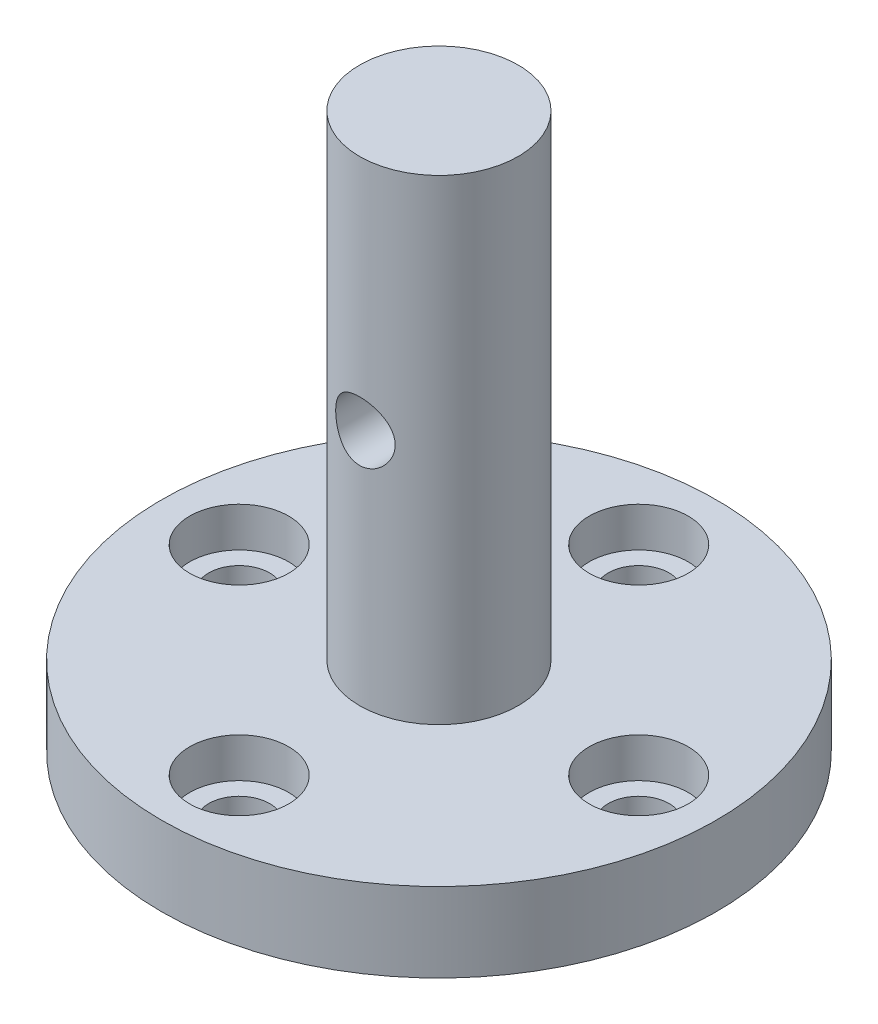
ISO-10303-21;
HEADER;
FILE_DESCRIPTION(('STEP AP214'),'2;1');
FILE_NAME('part.step','',(''),(''),'','','');
FILE_SCHEMA(('AUTOMOTIVE_DESIGN { 1 0 10303 214 1 1 1 1 }'));
ENDSEC;
DATA;
#1=APPLICATION_CONTEXT('core data for automotive mechanical design processes');
#2=APPLICATION_PROTOCOL_DEFINITION('international standard','automotive_design',2000,#1);
#3=PRODUCT_CONTEXT('',#1,'mechanical');
#4=PRODUCT('Part','Part','',(#3));
#5=PRODUCT_RELATED_PRODUCT_CATEGORY('part','',(#4));
#6=PRODUCT_DEFINITION_FORMATION('','',#4);
#7=PRODUCT_DEFINITION_CONTEXT('part definition',#1,'design');
#8=PRODUCT_DEFINITION('design','',#6,#7);
#9=PRODUCT_DEFINITION_SHAPE('','',#8);
#10=(LENGTH_UNIT() NAMED_UNIT(*) SI_UNIT(.MILLI.,.METRE.));
#11=(NAMED_UNIT(*) PLANE_ANGLE_UNIT() SI_UNIT($,.RADIAN.));
#12=(NAMED_UNIT(*) SI_UNIT($,.STERADIAN.) SOLID_ANGLE_UNIT());
#13=UNCERTAINTY_MEASURE_WITH_UNIT(LENGTH_MEASURE(1.E-05),#10,'distance_accuracy_value','');
#14=(GEOMETRIC_REPRESENTATION_CONTEXT(3) GLOBAL_UNCERTAINTY_ASSIGNED_CONTEXT((#13)) GLOBAL_UNIT_ASSIGNED_CONTEXT((#10,
#11,#12)) REPRESENTATION_CONTEXT('',''));
#15=CARTESIAN_POINT('',(0.,0.,0.));
#16=DIRECTION('',(0.,0.,1.));
#17=DIRECTION('',(1.,0.,0.));
#18=AXIS2_PLACEMENT_3D('',#15,#16,#17);
#19=CARTESIAN_POINT('',(8.,3.175,0.));
#20=DIRECTION('',(0.,1.,0.));
#21=DIRECTION('',(0.,0.,1.));
#22=AXIS2_PLACEMENT_3D('',#19,#20,#21);
#23=CYLINDRICAL_SURFACE('',#22,1.21919999999999);
#24=CARTESIAN_POINT('',(8.,0.,0.));
#25=DIRECTION('',(0.,1.,0.));
#26=DIRECTION('',(0.,0.,1.));
#27=AXIS2_PLACEMENT_3D('',#24,#25,#26);
#28=CIRCLE('',#27,1.2192);
#29=CARTESIAN_POINT('',(8.,0.,1.2192));
#30=VERTEX_POINT('',#29);
#31=EDGE_CURVE('E146',#30,#30,#28,.T.);
#32=ORIENTED_EDGE('',*,*,#31,.F.);
#33=EDGE_LOOP('',(#32));
#34=FACE_BOUND('',#33,.T.);
#35=CARTESIAN_POINT('',(8.,1.5875,0.));
#36=DIRECTION('',(0.,1.,0.));
#37=DIRECTION('',(0.,0.,1.));
#38=AXIS2_PLACEMENT_3D('',#35,#36,#37);
#39=CIRCLE('',#38,1.21919999999999);
#40=CARTESIAN_POINT('',(8.,1.5875,1.21919999999999));
#41=VERTEX_POINT('',#40);
#42=EDGE_CURVE('E74',#41,#41,#39,.F.);
#43=ORIENTED_EDGE('',*,*,#42,.F.);
#44=EDGE_LOOP('',(#43));
#45=FACE_BOUND('',#44,.T.);
#46=ADVANCED_FACE('F49',(#34,#45),#23,.F.);
#47=CARTESIAN_POINT('',(-8.,3.175,0.));
#48=DIRECTION('',(0.,1.,0.));
#49=DIRECTION('',(0.,0.,1.));
#50=AXIS2_PLACEMENT_3D('',#47,#48,#49);
#51=CYLINDRICAL_SURFACE('',#50,1.21919999999999);
#52=CARTESIAN_POINT('',(-8.,0.,0.));
#53=DIRECTION('',(0.,1.,0.));
#54=DIRECTION('',(0.,0.,1.));
#55=AXIS2_PLACEMENT_3D('',#52,#53,#54);
#56=CIRCLE('',#55,1.2192);
#57=CARTESIAN_POINT('',(-8.,0.,1.2192));
#58=VERTEX_POINT('',#57);
#59=EDGE_CURVE('E153',#58,#58,#56,.T.);
#60=ORIENTED_EDGE('',*,*,#59,.F.);
#61=EDGE_LOOP('',(#60));
#62=FACE_BOUND('',#61,.T.);
#63=CARTESIAN_POINT('',(-8.,1.5875,0.));
#64=DIRECTION('',(0.,1.,0.));
#65=DIRECTION('',(0.,0.,1.));
#66=AXIS2_PLACEMENT_3D('',#63,#64,#65);
#67=CIRCLE('',#66,1.21919999999999);
#68=CARTESIAN_POINT('',(-8.,1.5875,1.21919999999999));
#69=VERTEX_POINT('',#68);
#70=EDGE_CURVE('E168',#69,#69,#67,.F.);
#71=ORIENTED_EDGE('',*,*,#70,.F.);
#72=EDGE_LOOP('',(#71));
#73=FACE_BOUND('',#72,.T.);
#74=ADVANCED_FACE('F126',(#62,#73),#51,.F.);
#75=CARTESIAN_POINT('',(0.,3.175,-8.));
#76=DIRECTION('',(0.,1.,0.));
#77=DIRECTION('',(0.,0.,1.));
#78=AXIS2_PLACEMENT_3D('',#75,#76,#77);
#79=CYLINDRICAL_SURFACE('',#78,1.21919999999999);
#80=CARTESIAN_POINT('',(0.,0.,-8.));
#81=DIRECTION('',(0.,1.,0.));
#82=DIRECTION('',(0.,0.,1.));
#83=AXIS2_PLACEMENT_3D('',#80,#81,#82);
#84=CIRCLE('',#83,1.2192);
#85=CARTESIAN_POINT('',(0.,0.,-6.7808));
#86=VERTEX_POINT('',#85);
#87=EDGE_CURVE('E180',#86,#86,#84,.T.);
#88=ORIENTED_EDGE('',*,*,#87,.F.);
#89=EDGE_LOOP('',(#88));
#90=FACE_BOUND('',#89,.T.);
#91=CARTESIAN_POINT('',(0.,1.5875,-8.));
#92=DIRECTION('',(0.,1.,0.));
#93=DIRECTION('',(0.,0.,1.));
#94=AXIS2_PLACEMENT_3D('',#91,#92,#93);
#95=CIRCLE('',#94,1.21919999999999);
#96=CARTESIAN_POINT('',(0.,1.5875,-6.78080000000001));
#97=VERTEX_POINT('',#96);
#98=EDGE_CURVE('E164',#97,#97,#95,.F.);
#99=ORIENTED_EDGE('',*,*,#98,.F.);
#100=EDGE_LOOP('',(#99));
#101=FACE_BOUND('',#100,.T.);
#102=ADVANCED_FACE('F122',(#90,#101),#79,.F.);
#103=CARTESIAN_POINT('',(0.,3.175,8.));
#104=DIRECTION('',(0.,1.,0.));
#105=DIRECTION('',(0.,0.,1.));
#106=AXIS2_PLACEMENT_3D('',#103,#104,#105);
#107=CYLINDRICAL_SURFACE('',#106,1.21919999999999);
#108=CARTESIAN_POINT('',(0.,0.,8.));
#109=DIRECTION('',(0.,1.,0.));
#110=DIRECTION('',(0.,0.,1.));
#111=AXIS2_PLACEMENT_3D('',#108,#109,#110);
#112=CIRCLE('',#111,1.2192);
#113=CARTESIAN_POINT('',(0.,0.,9.2192));
#114=VERTEX_POINT('',#113);
#115=EDGE_CURVE('E175',#114,#114,#112,.T.);
#116=ORIENTED_EDGE('',*,*,#115,.F.);
#117=EDGE_LOOP('',(#116));
#118=FACE_BOUND('',#117,.T.);
#119=CARTESIAN_POINT('',(0.,1.5875,8.));
#120=DIRECTION('',(0.,1.,0.));
#121=DIRECTION('',(0.,0.,1.));
#122=AXIS2_PLACEMENT_3D('',#119,#120,#121);
#123=CIRCLE('',#122,1.21919999999999);
#124=CARTESIAN_POINT('',(0.,1.5875,9.21919999999999));
#125=VERTEX_POINT('',#124);
#126=EDGE_CURVE('E160',#125,#125,#123,.F.);
#127=ORIENTED_EDGE('',*,*,#126,.F.);
#128=EDGE_LOOP('',(#127));
#129=FACE_BOUND('',#128,.T.);
#130=ADVANCED_FACE('F119',(#118,#129),#107,.F.);
#131=CARTESIAN_POINT('',(0.,3.175,0.));
#132=DIRECTION('',(0.,-1.,0.));
#133=DIRECTION('',(0.,0.,-1.));
#134=AXIS2_PLACEMENT_3D('',#131,#132,#133);
#135=CYLINDRICAL_SURFACE('',#134,11.1125);
#136=CARTESIAN_POINT('',(0.,3.175,0.));
#137=DIRECTION('',(0.,1.,0.));
#138=DIRECTION('',(0.,0.,1.));
#139=AXIS2_PLACEMENT_3D('',#136,#137,#138);
#140=CIRCLE('',#139,11.1125);
#141=CARTESIAN_POINT('',(0.,3.175,11.1125));
#142=VERTEX_POINT('',#141);
#143=EDGE_CURVE('E68',#142,#142,#140,.T.);
#144=ORIENTED_EDGE('',*,*,#143,.F.);
#145=EDGE_LOOP('',(#144));
#146=FACE_BOUND('',#145,.T.);
#147=CARTESIAN_POINT('',(0.,0.,0.));
#148=DIRECTION('',(0.,1.,0.));
#149=DIRECTION('',(0.,0.,1.));
#150=AXIS2_PLACEMENT_3D('',#147,#148,#149);
#151=CIRCLE('',#150,11.1125);
#152=CARTESIAN_POINT('',(0.,0.,11.1125));
#153=VERTEX_POINT('',#152);
#154=EDGE_CURVE('E145',#153,#153,#151,.T.);
#155=ORIENTED_EDGE('',*,*,#154,.T.);
#156=EDGE_LOOP('',(#155));
#157=FACE_BOUND('',#156,.T.);
#158=ADVANCED_FACE('F51',(#146,#157),#135,.T.);
#159=CARTESIAN_POINT('',(0.,3.175,0.));
#160=DIRECTION('',(0.,1.,0.));
#161=DIRECTION('',(0.,0.,1.));
#162=AXIS2_PLACEMENT_3D('',#159,#160,#161);
#163=PLANE('',#162);
#164=CARTESIAN_POINT('',(0.,3.175,8.));
#165=DIRECTION('',(0.,1.,0.));
#166=DIRECTION('',(0.,0.,1.));
#167=AXIS2_PLACEMENT_3D('',#164,#165,#166);
#168=CIRCLE('',#167,1.984375);
#169=CARTESIAN_POINT('',(0.,3.175,9.984375));
#170=VERTEX_POINT('',#169);
#171=EDGE_CURVE('E215',#170,#170,#168,.T.);
#172=ORIENTED_EDGE('',*,*,#171,.F.);
#173=EDGE_LOOP('',(#172));
#174=FACE_BOUND('',#173,.T.);
#175=CARTESIAN_POINT('',(8.,3.175,0.));
#176=DIRECTION('',(0.,1.,0.));
#177=DIRECTION('',(0.,0.,1.));
#178=AXIS2_PLACEMENT_3D('',#175,#176,#177);
#179=CIRCLE('',#178,1.984375);
#180=CARTESIAN_POINT('',(8.,3.175,1.984375));
#181=VERTEX_POINT('',#180);
#182=EDGE_CURVE('E219',#181,#181,#179,.T.);
#183=ORIENTED_EDGE('',*,*,#182,.F.);
#184=EDGE_LOOP('',(#183));
#185=FACE_BOUND('',#184,.T.);
#186=CARTESIAN_POINT('',(0.,3.175,-8.));
#187=DIRECTION('',(0.,1.,0.));
#188=DIRECTION('',(0.,0.,1.));
#189=AXIS2_PLACEMENT_3D('',#186,#187,#188);
#190=CIRCLE('',#189,1.984375);
#191=CARTESIAN_POINT('',(0.,3.175,-6.015625));
#192=VERTEX_POINT('',#191);
#193=EDGE_CURVE('E223',#192,#192,#190,.T.);
#194=ORIENTED_EDGE('',*,*,#193,.F.);
#195=EDGE_LOOP('',(#194));
#196=FACE_BOUND('',#195,.T.);
#197=CARTESIAN_POINT('',(-8.,3.175,0.));
#198=DIRECTION('',(0.,1.,0.));
#199=DIRECTION('',(0.,0.,1.));
#200=AXIS2_PLACEMENT_3D('',#197,#198,#199);
#201=CIRCLE('',#200,1.984375);
#202=CARTESIAN_POINT('',(-8.,3.175,1.984375));
#203=VERTEX_POINT('',#202);
#204=EDGE_CURVE('E188',#203,#203,#201,.T.);
#205=ORIENTED_EDGE('',*,*,#204,.F.);
#206=EDGE_LOOP('',(#205));
#207=FACE_BOUND('',#206,.T.);
#208=CARTESIAN_POINT('',(0.,3.175,0.));
#209=DIRECTION('',(0.,1.,0.));
#210=DIRECTION('',(0.,0.,1.));
#211=AXIS2_PLACEMENT_3D('',#208,#209,#210);
#212=CIRCLE('',#211,3.175);
#213=CARTESIAN_POINT('',(0.,3.175,3.175));
#214=VERTEX_POINT('',#213);
#215=EDGE_CURVE('E63',#214,#214,#212,.T.);
#216=ORIENTED_EDGE('',*,*,#215,.F.);
#217=EDGE_LOOP('',(#216));
#218=FACE_BOUND('',#217,.T.);
#219=ORIENTED_EDGE('',*,*,#143,.T.);
#220=EDGE_LOOP('',(#219));
#221=FACE_BOUND('',#220,.T.);
#222=ADVANCED_FACE('F197',(#174,#185,#196,#207,#218,#221),#163,.T.);
#223=CARTESIAN_POINT('',(0.,0.,0.));
#224=DIRECTION('',(0.,1.,0.));
#225=DIRECTION('',(0.,0.,1.));
#226=AXIS2_PLACEMENT_3D('',#223,#224,#225);
#227=PLANE('',#226);
#228=ORIENTED_EDGE('',*,*,#115,.T.);
#229=EDGE_LOOP('',(#228));
#230=FACE_BOUND('',#229,.T.);
#231=ORIENTED_EDGE('',*,*,#87,.T.);
#232=EDGE_LOOP('',(#231));
#233=FACE_BOUND('',#232,.T.);
#234=ORIENTED_EDGE('',*,*,#59,.T.);
#235=EDGE_LOOP('',(#234));
#236=FACE_BOUND('',#235,.T.);
#237=ORIENTED_EDGE('',*,*,#31,.T.);
#238=EDGE_LOOP('',(#237));
#239=FACE_BOUND('',#238,.T.);
#240=ORIENTED_EDGE('',*,*,#154,.F.);
#241=EDGE_LOOP('',(#240));
#242=FACE_BOUND('',#241,.T.);
#243=ADVANCED_FACE('F138',(#230,#233,#236,#239,#242),#227,.F.);
#244=CARTESIAN_POINT('',(0.,22.225,0.));
#245=DIRECTION('',(0.,-1.,0.));
#246=DIRECTION('',(0.,0.,-1.));
#247=AXIS2_PLACEMENT_3D('',#244,#245,#246);
#248=CYLINDRICAL_SURFACE('',#247,3.175);
#249=CARTESIAN_POINT('',(0.,13.890625,-3.175));
#250=CARTESIAN_POINT('',(-0.0644803280319205,13.8906273037031,-3.1750017260582));
#251=CARTESIAN_POINT('',(-0.128944879414297,13.8853705653028,-3.17301863556027));
#252=CARTESIAN_POINT('',(-0.255947427804686,13.8645676200045,-3.16530589955499));
#253=CARTESIAN_POINT('',(-0.31848570096517,13.8490228952515,-3.15957679372107));
#254=CARTESIAN_POINT('',(-0.43978574808651,13.8082710548437,-3.14498698210789));
#255=CARTESIAN_POINT('',(-0.498554552928808,13.7830825772727,-3.13613231952368));
#256=CARTESIAN_POINT('',(-0.611028202439701,13.7238530346687,-3.11617334413749));
#257=CARTESIAN_POINT('',(-0.664731683597441,13.6898095952243,-3.10506842811866));
#258=CARTESIAN_POINT('',(-0.767831218530123,13.6123263034625,-3.08122833533403));
#259=CARTESIAN_POINT('',(-0.816983642057507,13.5685766043316,-3.06844702050705));
#260=CARTESIAN_POINT('',(-0.907450095452755,13.4735804674895,-3.04292175316616));
#261=CARTESIAN_POINT('',(-0.948761726101169,13.4223317436053,-3.03017781325932));
#262=CARTESIAN_POINT('',(-1.02392323008938,13.3114117601535,-3.00563336052824));
#263=CARTESIAN_POINT('',(-1.05742893349134,13.2514940340543,-2.99388727501525));
#264=CARTESIAN_POINT('',(-1.11377925527679,13.1263641188787,-2.97338639063463));
#265=CARTESIAN_POINT('',(-1.13662813187983,13.0611540567456,-2.96463039737106));
#266=CARTESIAN_POINT('',(-1.17005442120179,12.9300948374201,-2.95159440179158));
#267=CARTESIAN_POINT('',(-1.1810967711723,12.8643816257419,-2.94714552453477));
#268=CARTESIAN_POINT('',(-1.19205022996995,12.7318959245924,-2.94273336284839));
#269=CARTESIAN_POINT('',(-1.19196593587088,12.6651238839871,-2.94276822592073));
#270=CARTESIAN_POINT('',(-1.18102403502952,12.5366704393622,-2.94717399857943));
#271=CARTESIAN_POINT('',(-1.17081148004021,12.4749235308274,-2.95128528416453));
#272=CARTESIAN_POINT('',(-1.14096933245487,12.3540939493658,-2.96294919584752));
#273=CARTESIAN_POINT('',(-1.12133832170211,12.2950116791252,-2.97050234018473));
#274=CARTESIAN_POINT('',(-1.07286225428949,12.1798738274907,-2.98835526113513));
#275=CARTESIAN_POINT('',(-1.04384989935073,12.1238966578912,-2.99870429903107));
#276=CARTESIAN_POINT('',(-0.977551335491412,12.0174180707872,-3.02096654298085));
#277=CARTESIAN_POINT('',(-0.940262269910616,11.9669185528437,-3.03288028850369));
#278=CARTESIAN_POINT('',(-0.85551788483448,11.8692583419771,-3.05790630844421));
#279=CARTESIAN_POINT('',(-0.807547746065833,11.8225501414062,-3.07104532042939));
#280=CARTESIAN_POINT('',(-0.704304368962597,11.7377067393242,-3.09635309230243));
#281=CARTESIAN_POINT('',(-0.649030010276032,11.6995728554068,-3.10852170288599));
#282=CARTESIAN_POINT('',(-0.531592978112732,11.6324614973316,-3.13075950879707));
#283=CARTESIAN_POINT('',(-0.469337004114245,11.6036347324058,-3.1407933299357));
#284=CARTESIAN_POINT('',(-0.340389250103887,11.5570138078607,-3.15736857672026));
#285=CARTESIAN_POINT('',(-0.273699454858827,11.5392147481046,-3.1639115533356));
#286=CARTESIAN_POINT('',(-0.141585349249253,11.5160244123886,-3.17249526812277));
#287=CARTESIAN_POINT('',(-0.0762822480275034,11.5100238061839,-3.17475686664138));
#288=CARTESIAN_POINT('',(0.0544294022336757,11.5088264680294,-3.17520553124475));
#289=CARTESIAN_POINT('',(0.119837924680552,11.5136273407486,-3.17339350069573));
#290=CARTESIAN_POINT('',(0.246270501045976,11.5334335960825,-3.16604419632035));
#291=CARTESIAN_POINT('',(0.307366454105823,11.5480397878413,-3.16065273826329));
#292=CARTESIAN_POINT('',(0.426197517997294,11.5865164450844,-3.1468335994155));
#293=CARTESIAN_POINT('',(0.483932190588356,11.6103881154963,-3.13840552373861));
#294=CARTESIAN_POINT('',(0.596302913556186,11.6674792148738,-3.11903764373597));
#295=CARTESIAN_POINT('',(0.650798072574,11.7009526975711,-3.1080313141617));
#296=CARTESIAN_POINT('',(0.753580464933009,11.7760099943924,-3.08472420554452));
#297=CARTESIAN_POINT('',(0.80186539546467,11.8175968027077,-3.07242294938803));
#298=CARTESIAN_POINT('',(0.89378694650348,11.9105395219361,-3.04699455283473));
#299=CARTESIAN_POINT('',(0.936991348355824,11.9623222325758,-3.03386090349835));
#300=CARTESIAN_POINT('',(1.01418270962823,12.0726607866117,-3.00893809999065));
#301=CARTESIAN_POINT('',(1.04816884135274,12.1312172375396,-2.99714906660554));
#302=CARTESIAN_POINT('',(1.10599357730704,12.2539251895005,-2.9762992117158));
#303=CARTESIAN_POINT('',(1.12978950323491,12.3180988920664,-2.96724991010742));
#304=CARTESIAN_POINT('',(1.16608132501843,12.4499764999272,-2.95317888607235));
#305=CARTESIAN_POINT('',(1.17858421180018,12.5176781937323,-2.94815467214383));
#306=CARTESIAN_POINT('',(1.1913103800891,12.6500065766358,-2.94303366491605));
#307=CARTESIAN_POINT('',(1.19227069374821,12.7145515264253,-2.94264115340402));
#308=CARTESIAN_POINT('',(1.18377268040514,12.8428315947942,-2.94606990116576));
#309=CARTESIAN_POINT('',(1.17431534131035,12.9065667895831,-2.94989076088501));
#310=CARTESIAN_POINT('',(1.14582428656504,13.0294437362063,-2.96106962383437));
#311=CARTESIAN_POINT('',(1.12709164913741,13.0886663123322,-2.96831611517726));
#312=CARTESIAN_POINT('',(1.08084696819061,13.2031624973675,-2.98546478961414));
#313=CARTESIAN_POINT('',(1.0533327052505,13.2584351036557,-2.99536764396202));
#314=CARTESIAN_POINT('',(0.988632102759093,13.3666125143225,-3.01735905848772));
#315=CARTESIAN_POINT('',(0.951014360373892,13.4192413199599,-3.02953498137515));
#316=CARTESIAN_POINT('',(0.867842480481127,13.5176748640209,-3.0543995836351));
#317=CARTESIAN_POINT('',(0.822285820601663,13.563477424987,-3.06708842498621));
#318=CARTESIAN_POINT('',(0.721582564947792,13.6494853024336,-3.09237399534093));
#319=CARTESIAN_POINT('',(0.666050423844061,13.6892536042888,-3.10492858264887));
#320=CARTESIAN_POINT('',(0.54865049591565,13.7588804826258,-3.12780770850268));
#321=CARTESIAN_POINT('',(0.486782216434429,13.7887382877657,-3.13813207344675));
#322=CARTESIAN_POINT('',(0.355599271339334,13.8385366080571,-3.15574594756552));
#323=CARTESIAN_POINT('',(0.286078153898402,13.8579916075278,-3.16288465369445));
#324=CARTESIAN_POINT('',(0.144363863550065,13.884031286937,-3.17250954730047));
#325=CARTESIAN_POINT('',(0.0721720492396065,13.8906224214931,-3.17499806804399));
#326=CARTESIAN_POINT('',(0.,13.890625,-3.175));
#327=B_SPLINE_CURVE_WITH_KNOTS('',3,(#249,#250,#251,#252,#253,#254,#255,#256,#257,#258,#259,
#260,#261,#262,#263,#264,#265,#266,#267,#268,#269,#270,#271,#272,#273,#274,#275,#276,#277,#278,
#279,#280,#281,#282,#283,#284,#285,#286,#287,#288,#289,#290,#291,#292,#293,#294,#295,#296,#297,
#298,#299,#300,#301,#302,#303,#304,#305,#306,#307,#308,#309,#310,#311,#312,#313,#314,#315,#316,
#317,#318,#319,#320,#321,#322,#323,#324,#325,#326),.UNSPECIFIED.,.T.,.F.,(4,2,2,2,2,2,2,2,2,2,2,
2,2,2,2,2,2,2,2,2,2,2,2,2,2,2,2,2,2,2,2,2,2,2,2,2,2,2,4),(0.,0.193174779988694,
0.386321736189803,0.579097274313274,0.771924557565032,0.972134347500303,1.17240530159712,
1.38030485385691,1.58812126298256,1.78741287818415,1.98662215450767,2.17390936438977,
2.36122478335592,2.55208411657195,2.74300942653255,2.94676634210301,3.15055454712146,
3.35749404133322,3.56434151635958,3.76019234336015,3.95599974284975,4.14428335102048,
4.33259145270722,4.52643257351057,4.7203453664077,4.92550862317928,5.13069029517861,
5.33672309214718,5.54262825746727,5.73531018512449,5.92797384230186,6.1147574430106,
6.30158828783601,6.49821274558139,6.69489978960167,6.90223036662893,7.10957707657799,
7.32590383806683,7.54212202675675),.UNSPECIFIED.);
#328=CARTESIAN_POINT('',(0.,13.890625,-3.175));
#329=VERTEX_POINT('',#328);
#330=EDGE_CURVE('E53',#329,#329,#327,.T.);
#331=ORIENTED_EDGE('',*,*,#330,.T.);
#332=EDGE_LOOP('',(#331));
#333=FACE_BOUND('',#332,.T.);
#334=CARTESIAN_POINT('',(1.190625,12.7,2.94330377456609));
#335=CARTESIAN_POINT('',(1.19062741384224,12.6357003097966,2.94330152253084));
#336=CARTESIAN_POINT('',(1.18539893054905,12.5714165302627,2.94543369066283));
#337=CARTESIAN_POINT('',(1.16471849142027,12.4447870841877,2.95367201448317));
#338=CARTESIAN_POINT('',(1.14926684177528,12.382441359659,2.95977805115145));
#339=CARTESIAN_POINT('',(1.10878665728393,12.2615520487818,2.97517724972965));
#340=CARTESIAN_POINT('',(1.08378106892664,12.2029997425332,2.984462769706));
#341=CARTESIAN_POINT('',(1.02498411289516,12.0908985569,3.00516237776487));
#342=CARTESIAN_POINT('',(0.991190106254367,12.0373511869633,3.01657710490938));
#343=CARTESIAN_POINT('',(0.913976624657409,11.9341183151494,3.0408846239091));
#344=CARTESIAN_POINT('',(0.870191150880617,11.8847167296067,3.0538209015186));
#345=CARTESIAN_POINT('',(0.775014197824521,11.7937575158545,3.07935114561409));
#346=CARTESIAN_POINT('',(0.723621100266238,11.7522015608424,3.09194503859236));
#347=CARTESIAN_POINT('',(0.612532632547218,11.6767455121154,3.11588843687139));
#348=CARTESIAN_POINT('',(0.552614264608307,11.6431540419443,3.12718101721158));
#349=CARTESIAN_POINT('',(0.427478643997412,11.5866456318084,3.14672668829241));
#350=CARTESIAN_POINT('',(0.362263238303492,11.5637249897314,3.15498083297249));
#351=CARTESIAN_POINT('',(0.231369664955984,11.5302046702289,3.16721090825855));
#352=CARTESIAN_POINT('',(0.165832787842265,11.5191161957191,3.17135601451727));
#353=CARTESIAN_POINT('',(0.0337060887621098,11.5080087967499,3.17550811198178));
#354=CARTESIAN_POINT('',(-0.0328833837686252,11.5079862727652,3.17551644879329));
#355=CARTESIAN_POINT('',(-0.161721437307429,11.518726773163,3.17150167311216));
#356=CARTESIAN_POINT('',(-0.224021791499353,11.5289562552469,3.16767798959867));
#357=CARTESIAN_POINT('',(-0.345947379275111,11.5590128827103,3.15669036977483));
#358=CARTESIAN_POINT('',(-0.4055724230978,11.578840707733,3.14952619693115));
#359=CARTESIAN_POINT('',(-0.52148503248434,11.6277790460177,3.13243729276727));
#360=CARTESIAN_POINT('',(-0.577711405128053,11.6570204416818,3.12247390704374));
#361=CARTESIAN_POINT('',(-0.684598745066314,11.7238399769377,3.10079477491315));
#362=CARTESIAN_POINT('',(-0.735257909190032,11.7614208057702,3.08907846363317));
#363=CARTESIAN_POINT('',(-0.832715573898243,11.8464229084873,3.06429195414304));
#364=CARTESIAN_POINT('',(-0.879114752802888,11.8942912955475,3.05118264987582));
#365=CARTESIAN_POINT('',(-0.963377514831655,11.997208188449,3.02563578137542));
#366=CARTESIAN_POINT('',(-1.00123895424989,12.0522584921032,3.01319838644397));
#367=CARTESIAN_POINT('',(-1.0681145437272,12.1695523272986,2.99015708403391));
#368=CARTESIAN_POINT('',(-1.09691366732391,12.2319283981133,2.97959999988032));
#369=CARTESIAN_POINT('',(-1.14344818650441,12.3611451287268,2.96205623161771));
#370=CARTESIAN_POINT('',(-1.16118973855691,12.4279832812025,2.9550675611334));
#371=CARTESIAN_POINT('',(-1.18419714669549,12.5602809200883,2.94592055295636));
#372=CARTESIAN_POINT('',(-1.19009732419929,12.6256130087693,2.9435169828547));
#373=CARTESIAN_POINT('',(-1.19108446723791,12.7563636769138,2.94311815747981));
#374=CARTESIAN_POINT('',(-1.18617413493173,12.8217822306798,2.94512180059414));
#375=CARTESIAN_POINT('',(-1.16625475981624,12.9475943758159,2.95306259168602));
#376=CARTESIAN_POINT('',(-1.15173615802791,13.0080790890132,2.95880850496806));
#377=CARTESIAN_POINT('',(-1.11362946121006,13.1257261811217,2.97335961593049));
#378=CARTESIAN_POINT('',(-1.09003950802482,13.1828878765897,2.98216544036075));
#379=CARTESIAN_POINT('',(-1.03346481993502,13.294649272723,3.00225017973388));
#380=CARTESIAN_POINT('',(-1.00016107734281,13.349072625634,3.01360942308077));
#381=CARTESIAN_POINT('',(-0.925443585533426,13.451783629245,3.03738608846094));
#382=CARTESIAN_POINT('',(-0.884026868090448,13.5000690236083,3.04980389684049));
#383=CARTESIAN_POINT('',(-0.791152326840117,13.5923086462236,3.0752498070159));
#384=CARTESIAN_POINT('',(-0.739224408558527,13.6357942682102,3.08826669427141));
#385=CARTESIAN_POINT('',(-0.628489243204061,13.7134904542741,3.11268963252121));
#386=CARTESIAN_POINT('',(-0.569681973824869,13.7477009882758,3.12409567829208));
#387=CARTESIAN_POINT('',(-0.446894211515601,13.8056509321084,3.14400394902988));
#388=CARTESIAN_POINT('',(-0.382932331245045,13.8294261795104,3.15251608937045));
#389=CARTESIAN_POINT('',(-0.251524998221581,13.8657460284934,3.16570865390603));
#390=CARTESIAN_POINT('',(-0.18408119832435,13.878295907804,3.17039087868909));
#391=CARTESIAN_POINT('',(-0.0518601208110894,13.8912396821866,3.17522548307927));
#392=CARTESIAN_POINT('',(0.0128434846482975,13.8922994021781,3.1756259588205));
#393=CARTESIAN_POINT('',(0.141467511714863,13.8839454671902,3.17249881286071));
#394=CARTESIAN_POINT('',(0.205388026838424,13.8745330753594,3.16897166491047));
#395=CARTESIAN_POINT('',(0.329047672149345,13.8459695366269,3.15849864872993));
#396=CARTESIAN_POINT('',(0.388850767785888,13.8270615747091,3.15163828156301));
#397=CARTESIAN_POINT('',(0.504440406698822,13.7802858018762,3.13521553249161));
#398=CARTESIAN_POINT('',(0.560226187199962,13.7524162948769,3.12565263914183));
#399=CARTESIAN_POINT('',(0.668766265489315,13.6871758073431,3.10428178275684));
#400=CARTESIAN_POINT('',(0.721294554397187,13.6494546665919,3.09239634336383));
#401=CARTESIAN_POINT('',(0.819481269596668,13.5661337847886,3.06783984232783));
#402=CARTESIAN_POINT('',(0.86513723280937,13.520531231515,3.05516850130009));
#403=CARTESIAN_POINT('',(0.950763387999802,13.4198803455067,3.0296495298047));
#404=CARTESIAN_POINT('',(0.990306311039699,13.36446050579,3.01682789245896));
#405=CARTESIAN_POINT('',(1.05953488210744,13.2473574035262,2.99321795471638));
#406=CARTESIAN_POINT('',(1.08921950747037,13.1856734920326,2.98242986532278));
#407=CARTESIAN_POINT('',(1.13876047785819,13.0548414282258,2.9638805169603));
#408=CARTESIAN_POINT('',(1.15812889801496,12.9854845965813,2.9562726886212));
#409=CARTESIAN_POINT('',(1.1840555814815,12.8440773153851,2.9459872050445));
#410=CARTESIAN_POINT('',(1.19062229600784,12.7720286749114,2.94330629730166));
#411=CARTESIAN_POINT('',(1.190625,12.7,2.94330377456609));
#412=B_SPLINE_CURVE_WITH_KNOTS('',3,(#334,#335,#336,#337,#338,#339,#340,#341,#342,#343,#344,
#345,#346,#347,#348,#349,#350,#351,#352,#353,#354,#355,#356,#357,#358,#359,#360,#361,#362,#363,
#364,#365,#366,#367,#368,#369,#370,#371,#372,#373,#374,#375,#376,#377,#378,#379,#380,#381,#382,
#383,#384,#385,#386,#387,#388,#389,#390,#391,#392,#393,#394,#395,#396,#397,#398,#399,#400,#401,
#402,#403,#404,#405,#406,#407,#408,#409,#410,#411),.UNSPECIFIED.,.T.,.F.,(4,2,2,2,2,2,2,2,2,2,2,
2,2,2,2,2,2,2,2,2,2,2,2,2,2,2,2,2,2,2,2,2,2,2,2,2,2,2,4),(0.,0.192630854749086,
0.385255940337841,0.577421261300893,0.769644351998328,0.970555053433952,1.17150855378243,
1.37929994758284,1.58701919690181,1.78577889676183,1.98447394415105,2.17333887787535,
2.36221718677772,2.55384404148467,2.74553278067999,2.94843735833538,3.15139282587947,
3.35885307600792,3.56619771610657,3.7621024083151,3.95795813839926,4.14451677705507,
4.33111365034686,4.5247048904837,4.71836709095169,4.92430607238689,5.13024572159828,
5.33547247681571,5.5406026916335,5.73377790686511,5.92692982378586,6.11536967490587,
6.30384521163309,6.50024356918608,6.69671215022877,6.90355013386524,7.11040956744492,
7.32633773228797,7.54212330093922),.UNSPECIFIED.);
#413=CARTESIAN_POINT('',(1.190625,12.7,2.94330377456609));
#414=VERTEX_POINT('',#413);
#415=EDGE_CURVE('E12',#414,#414,#412,.T.);
#416=ORIENTED_EDGE('',*,*,#415,.T.);
#417=EDGE_LOOP('',(#416));
#418=FACE_BOUND('',#417,.T.);
#419=CARTESIAN_POINT('',(0.,22.225,0.));
#420=DIRECTION('',(0.,1.,0.));
#421=DIRECTION('',(0.,0.,1.));
#422=AXIS2_PLACEMENT_3D('',#419,#420,#421);
#423=CIRCLE('',#422,3.175);
#424=CARTESIAN_POINT('',(0.,22.225,3.175));
#425=VERTEX_POINT('',#424);
#426=EDGE_CURVE('E142',#425,#425,#423,.T.);
#427=ORIENTED_EDGE('',*,*,#426,.F.);
#428=EDGE_LOOP('',(#427));
#429=FACE_BOUND('',#428,.T.);
#430=ORIENTED_EDGE('',*,*,#215,.T.);
#431=EDGE_LOOP('',(#430));
#432=FACE_BOUND('',#431,.T.);
#433=ADVANCED_FACE('F76',(#333,#418,#429,#432),#248,.T.);
#434=CARTESIAN_POINT('',(0.,22.225,0.));
#435=DIRECTION('',(0.,1.,0.));
#436=DIRECTION('',(0.,0.,1.));
#437=AXIS2_PLACEMENT_3D('',#434,#435,#436);
#438=PLANE('',#437);
#439=ORIENTED_EDGE('',*,*,#426,.T.);
#440=EDGE_LOOP('',(#439));
#441=FACE_BOUND('',#440,.T.);
#442=ADVANCED_FACE('F91',(#441),#438,.T.);
#443=CARTESIAN_POINT('',(0.,1.5875,8.));
#444=DIRECTION('',(0.,1.,0.));
#445=DIRECTION('',(0.,0.,1.));
#446=AXIS2_PLACEMENT_3D('',#443,#444,#445);
#447=PLANE('',#446);
#448=CARTESIAN_POINT('',(0.,1.5875,8.));
#449=DIRECTION('',(0.,1.,0.));
#450=DIRECTION('',(0.,0.,1.));
#451=AXIS2_PLACEMENT_3D('',#448,#449,#450);
#452=CIRCLE('',#451,1.984375);
#453=CARTESIAN_POINT('',(0.,1.5875,9.984375));
#454=VERTEX_POINT('',#453);
#455=EDGE_CURVE('E165',#454,#454,#452,.T.);
#456=ORIENTED_EDGE('',*,*,#455,.T.);
#457=EDGE_LOOP('',(#456));
#458=FACE_BOUND('',#457,.T.);
#459=ORIENTED_EDGE('',*,*,#126,.T.);
#460=EDGE_LOOP('',(#459));
#461=FACE_BOUND('',#460,.T.);
#462=ADVANCED_FACE('F86',(#458,#461),#447,.T.);
#463=CARTESIAN_POINT('',(0.,1.5875,8.));
#464=DIRECTION('',(0.,1.,0.));
#465=DIRECTION('',(0.,0.,1.));
#466=AXIS2_PLACEMENT_3D('',#463,#464,#465);
#467=CYLINDRICAL_SURFACE('',#466,1.984375);
#468=ORIENTED_EDGE('',*,*,#455,.F.);
#469=EDGE_LOOP('',(#468));
#470=FACE_BOUND('',#469,.T.);
#471=ORIENTED_EDGE('',*,*,#171,.T.);
#472=EDGE_LOOP('',(#471));
#473=FACE_BOUND('',#472,.T.);
#474=ADVANCED_FACE('F90',(#470,#473),#467,.F.);
#475=CARTESIAN_POINT('',(0.,1.5875,-8.));
#476=DIRECTION('',(0.,1.,0.));
#477=DIRECTION('',(0.,0.,1.));
#478=AXIS2_PLACEMENT_3D('',#475,#476,#477);
#479=PLANE('',#478);
#480=CARTESIAN_POINT('',(0.,1.5875,-8.));
#481=DIRECTION('',(0.,1.,0.));
#482=DIRECTION('',(0.,0.,1.));
#483=AXIS2_PLACEMENT_3D('',#480,#481,#482);
#484=CIRCLE('',#483,1.984375);
#485=CARTESIAN_POINT('',(0.,1.5875,-6.015625));
#486=VERTEX_POINT('',#485);
#487=EDGE_CURVE('E240',#486,#486,#484,.T.);
#488=ORIENTED_EDGE('',*,*,#487,.T.);
#489=EDGE_LOOP('',(#488));
#490=FACE_BOUND('',#489,.T.);
#491=ORIENTED_EDGE('',*,*,#98,.T.);
#492=EDGE_LOOP('',(#491));
#493=FACE_BOUND('',#492,.T.);
#494=ADVANCED_FACE('F95',(#490,#493),#479,.T.);
#495=CARTESIAN_POINT('',(0.,1.5875,-8.));
#496=DIRECTION('',(0.,1.,0.));
#497=DIRECTION('',(0.,0.,1.));
#498=AXIS2_PLACEMENT_3D('',#495,#496,#497);
#499=CYLINDRICAL_SURFACE('',#498,1.984375);
#500=ORIENTED_EDGE('',*,*,#487,.F.);
#501=EDGE_LOOP('',(#500));
#502=FACE_BOUND('',#501,.T.);
#503=ORIENTED_EDGE('',*,*,#193,.T.);
#504=EDGE_LOOP('',(#503));
#505=FACE_BOUND('',#504,.T.);
#506=ADVANCED_FACE('F107',(#502,#505),#499,.F.);
#507=CARTESIAN_POINT('',(-8.,1.5875,0.));
#508=DIRECTION('',(0.,1.,0.));
#509=DIRECTION('',(0.,0.,1.));
#510=AXIS2_PLACEMENT_3D('',#507,#508,#509);
#511=PLANE('',#510);
#512=CARTESIAN_POINT('',(-8.,1.5875,0.));
#513=DIRECTION('',(0.,1.,0.));
#514=DIRECTION('',(0.,0.,1.));
#515=AXIS2_PLACEMENT_3D('',#512,#513,#514);
#516=CIRCLE('',#515,1.984375);
#517=CARTESIAN_POINT('',(-8.,1.5875,1.984375));
#518=VERTEX_POINT('',#517);
#519=EDGE_CURVE('E231',#518,#518,#516,.T.);
#520=ORIENTED_EDGE('',*,*,#519,.T.);
#521=EDGE_LOOP('',(#520));
#522=FACE_BOUND('',#521,.T.);
#523=ORIENTED_EDGE('',*,*,#70,.T.);
#524=EDGE_LOOP('',(#523));
#525=FACE_BOUND('',#524,.T.);
#526=ADVANCED_FACE('F111',(#522,#525),#511,.T.);
#527=CARTESIAN_POINT('',(-8.,1.5875,0.));
#528=DIRECTION('',(0.,1.,0.));
#529=DIRECTION('',(0.,0.,1.));
#530=AXIS2_PLACEMENT_3D('',#527,#528,#529);
#531=CYLINDRICAL_SURFACE('',#530,1.984375);
#532=ORIENTED_EDGE('',*,*,#519,.F.);
#533=EDGE_LOOP('',(#532));
#534=FACE_BOUND('',#533,.T.);
#535=ORIENTED_EDGE('',*,*,#204,.T.);
#536=EDGE_LOOP('',(#535));
#537=FACE_BOUND('',#536,.T.);
#538=ADVANCED_FACE('F100',(#534,#537),#531,.F.);
#539=CARTESIAN_POINT('',(8.,1.5875,0.));
#540=DIRECTION('',(0.,1.,0.));
#541=DIRECTION('',(0.,0.,1.));
#542=AXIS2_PLACEMENT_3D('',#539,#540,#541);
#543=PLANE('',#542);
#544=CARTESIAN_POINT('',(8.,1.5875,0.));
#545=DIRECTION('',(0.,1.,0.));
#546=DIRECTION('',(0.,0.,1.));
#547=AXIS2_PLACEMENT_3D('',#544,#545,#546);
#548=CIRCLE('',#547,1.984375);
#549=CARTESIAN_POINT('',(8.,1.5875,1.984375));
#550=VERTEX_POINT('',#549);
#551=EDGE_CURVE('E248',#550,#550,#548,.T.);
#552=ORIENTED_EDGE('',*,*,#551,.T.);
#553=EDGE_LOOP('',(#552));
#554=FACE_BOUND('',#553,.T.);
#555=ORIENTED_EDGE('',*,*,#42,.T.);
#556=EDGE_LOOP('',(#555));
#557=FACE_BOUND('',#556,.T.);
#558=ADVANCED_FACE('F97',(#554,#557),#543,.T.);
#559=CARTESIAN_POINT('',(8.,1.5875,0.));
#560=DIRECTION('',(0.,1.,0.));
#561=DIRECTION('',(0.,0.,1.));
#562=AXIS2_PLACEMENT_3D('',#559,#560,#561);
#563=CYLINDRICAL_SURFACE('',#562,1.984375);
#564=ORIENTED_EDGE('',*,*,#551,.F.);
#565=EDGE_LOOP('',(#564));
#566=FACE_BOUND('',#565,.T.);
#567=ORIENTED_EDGE('',*,*,#182,.T.);
#568=EDGE_LOOP('',(#567));
#569=FACE_BOUND('',#568,.T.);
#570=ADVANCED_FACE('F84',(#566,#569),#563,.F.);
#571=CARTESIAN_POINT('',(0.,12.7,3.175));
#572=DIRECTION('',(0.,0.,1.));
#573=DIRECTION('',(1.,0.,0.));
#574=AXIS2_PLACEMENT_3D('',#571,#572,#573);
#575=CYLINDRICAL_SURFACE('',#574,1.190625);
#576=ORIENTED_EDGE('',*,*,#415,.F.);
#577=EDGE_LOOP('',(#576));
#578=FACE_BOUND('',#577,.T.);
#579=ORIENTED_EDGE('',*,*,#330,.F.);
#580=EDGE_LOOP('',(#579));
#581=FACE_BOUND('',#580,.T.);
#582=ADVANCED_FACE('F80',(#578,#581),#575,.F.);
#583=CLOSED_SHELL('',(#46,#74,#102,#130,#158,#222,#243,#433,#442,#462,#474,#494,#506,#526,#538,
#558,#570,#582));
#584=MANIFOLD_SOLID_BREP('B2',#583);
#585=ADVANCED_BREP_SHAPE_REPRESENTATION('',(#18,#584),#14);
#586=SHAPE_DEFINITION_REPRESENTATION(#9,#585);
ENDSEC;
END-ISO-10303-21;
